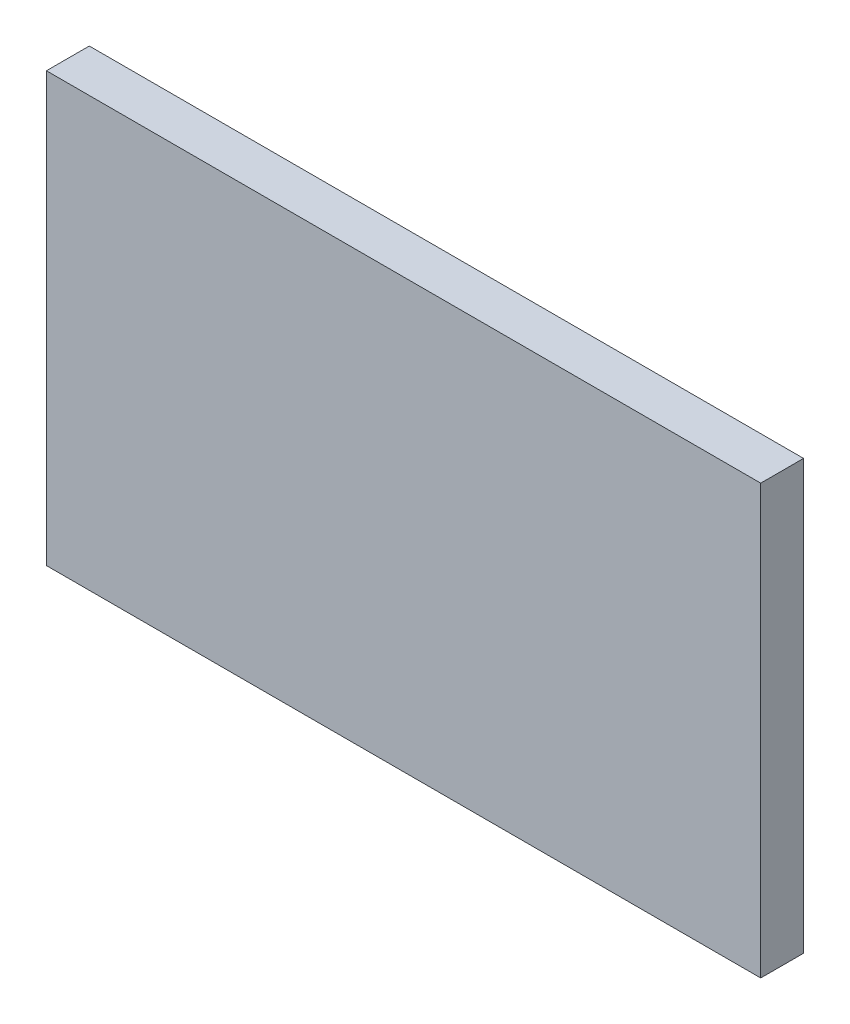
ISO-10303-21;
HEADER;
FILE_DESCRIPTION(('STEP AP214'),'2;1');
FILE_NAME('part.step','',(''),(''),'','','');
FILE_SCHEMA(('AUTOMOTIVE_DESIGN { 1 0 10303 214 1 1 1 1 }'));
ENDSEC;
DATA;
#1=APPLICATION_CONTEXT('core data for automotive mechanical design processes');
#2=APPLICATION_PROTOCOL_DEFINITION('international standard','automotive_design',2000,#1);
#3=PRODUCT_CONTEXT('',#1,'mechanical');
#4=PRODUCT('Part','Part','',(#3));
#5=PRODUCT_RELATED_PRODUCT_CATEGORY('part','',(#4));
#6=PRODUCT_DEFINITION_FORMATION('','',#4);
#7=PRODUCT_DEFINITION_CONTEXT('part definition',#1,'design');
#8=PRODUCT_DEFINITION('design','',#6,#7);
#9=PRODUCT_DEFINITION_SHAPE('','',#8);
#10=(LENGTH_UNIT() NAMED_UNIT(*) SI_UNIT(.MILLI.,.METRE.));
#11=(NAMED_UNIT(*) PLANE_ANGLE_UNIT() SI_UNIT($,.RADIAN.));
#12=(NAMED_UNIT(*) SI_UNIT($,.STERADIAN.) SOLID_ANGLE_UNIT());
#13=UNCERTAINTY_MEASURE_WITH_UNIT(LENGTH_MEASURE(1.E-05),#10,'distance_accuracy_value','');
#14=(GEOMETRIC_REPRESENTATION_CONTEXT(3) GLOBAL_UNCERTAINTY_ASSIGNED_CONTEXT((#13)) GLOBAL_UNIT_ASSIGNED_CONTEXT((#10,
#11,#12)) REPRESENTATION_CONTEXT('',''));
#15=CARTESIAN_POINT('',(0.,0.,0.));
#16=DIRECTION('',(0.,0.,1.));
#17=DIRECTION('',(1.,0.,0.));
#18=AXIS2_PLACEMENT_3D('',#15,#16,#17);
#19=CARTESIAN_POINT('',(6.200003917637,4.299994762363,0.2999994));
#20=DIRECTION('',(0.,0.,-1.));
#21=DIRECTION('',(-1.,0.,0.));
#22=AXIS2_PLACEMENT_3D('',#19,#20,#21);
#23=PLANE('',#22);
#24=DIRECTION('',(0.,1.,0.));
#25=VECTOR('',#24,1.);
#26=CARTESIAN_POINT('',(3.700003837637,2.799995222363,0.2999994));
#27=LINE('',#26,#25);
#28=CARTESIAN_POINT('',(3.700003837637,2.799995222363,0.2999994));
#29=VERTEX_POINT('',#28);
#30=CARTESIAN_POINT('',(3.700003837637,5.799994302363,0.2999994));
#31=VERTEX_POINT('',#30);
#32=EDGE_CURVE('E68',#29,#31,#27,.T.);
#33=ORIENTED_EDGE('',*,*,#32,.F.);
#34=DIRECTION('',(1.,0.,0.));
#35=VECTOR('',#34,1.);
#36=CARTESIAN_POINT('',(8.700003997637,2.799995222363,0.2999994));
#37=LINE('',#36,#35);
#38=CARTESIAN_POINT('',(8.700003997637,2.799995222363,0.2999994));
#39=VERTEX_POINT('',#38);
#40=EDGE_CURVE('E55',#39,#29,#37,.F.);
#41=ORIENTED_EDGE('',*,*,#40,.F.);
#42=DIRECTION('',(0.,1.,0.));
#43=VECTOR('',#42,1.);
#44=CARTESIAN_POINT('',(8.700003997637,5.799994302363,0.2999994));
#45=LINE('',#44,#43);
#46=CARTESIAN_POINT('',(8.700003997637,5.799994302363,0.2999994));
#47=VERTEX_POINT('',#46);
#48=EDGE_CURVE('E20',#47,#39,#45,.F.);
#49=ORIENTED_EDGE('',*,*,#48,.F.);
#50=DIRECTION('',(1.,0.,0.));
#51=VECTOR('',#50,1.);
#52=CARTESIAN_POINT('',(3.700003837637,5.799994302363,0.2999994));
#53=LINE('',#52,#51);
#54=EDGE_CURVE('E80',#31,#47,#53,.T.);
#55=ORIENTED_EDGE('',*,*,#54,.F.);
#56=EDGE_LOOP('',(#33,#41,#49,#55));
#57=FACE_BOUND('',#56,.T.);
#58=ADVANCED_FACE('F17',(#57),#23,.F.);
#59=CARTESIAN_POINT('',(8.700003997637,5.799994302363,0.));
#60=DIRECTION('',(1.,0.,0.));
#61=DIRECTION('',(0.,0.,-1.));
#62=AXIS2_PLACEMENT_3D('',#59,#60,#61);
#63=PLANE('',#62);
#64=DIRECTION('',(0.,0.,-1.));
#65=VECTOR('',#64,1.);
#66=CARTESIAN_POINT('',(8.700003997637,2.799995222363,0.));
#67=LINE('',#66,#65);
#68=CARTESIAN_POINT('',(8.700003997637,2.799995222363,0.));
#69=VERTEX_POINT('',#68);
#70=EDGE_CURVE('E61',#69,#39,#67,.F.);
#71=ORIENTED_EDGE('',*,*,#70,.F.);
#72=DIRECTION('',(0.,1.,0.));
#73=VECTOR('',#72,1.);
#74=CARTESIAN_POINT('',(8.700003997637,4.299994762363,0.));
#75=LINE('',#74,#73);
#76=CARTESIAN_POINT('',(8.700003997637,5.799994302363,0.));
#77=VERTEX_POINT('',#76);
#78=EDGE_CURVE('E83',#77,#69,#75,.F.);
#79=ORIENTED_EDGE('',*,*,#78,.F.);
#80=DIRECTION('',(0.,0.,1.));
#81=VECTOR('',#80,1.);
#82=CARTESIAN_POINT('',(8.700003997637,5.799994302363,0.));
#83=LINE('',#82,#81);
#84=EDGE_CURVE('E64',#47,#77,#83,.F.);
#85=ORIENTED_EDGE('',*,*,#84,.F.);
#86=ORIENTED_EDGE('',*,*,#48,.T.);
#87=EDGE_LOOP('',(#71,#79,#85,#86));
#88=FACE_BOUND('',#87,.T.);
#89=ADVANCED_FACE('F60',(#88),#63,.T.);
#90=CARTESIAN_POINT('',(8.700003997637,2.799995222363,0.));
#91=DIRECTION('',(0.,-1.,0.));
#92=DIRECTION('',(0.,0.,-1.));
#93=AXIS2_PLACEMENT_3D('',#90,#91,#92);
#94=PLANE('',#93);
#95=DIRECTION('',(0.,0.,1.));
#96=VECTOR('',#95,1.);
#97=CARTESIAN_POINT('',(3.700003837637,2.799995222363,0.));
#98=LINE('',#97,#96);
#99=CARTESIAN_POINT('',(3.700003837637,2.799995222363,0.));
#100=VERTEX_POINT('',#99);
#101=EDGE_CURVE('E70',#100,#29,#98,.T.);
#102=ORIENTED_EDGE('',*,*,#101,.F.);
#103=DIRECTION('',(-1.,0.,0.));
#104=VECTOR('',#103,1.);
#105=CARTESIAN_POINT('',(6.200003917637,2.799995222363,0.));
#106=LINE('',#105,#104);
#107=EDGE_CURVE('E74',#69,#100,#106,.T.);
#108=ORIENTED_EDGE('',*,*,#107,.F.);
#109=ORIENTED_EDGE('',*,*,#70,.T.);
#110=ORIENTED_EDGE('',*,*,#40,.T.);
#111=EDGE_LOOP('',(#102,#108,#109,#110));
#112=FACE_BOUND('',#111,.T.);
#113=ADVANCED_FACE('F72',(#112),#94,.T.);
#114=CARTESIAN_POINT('',(3.700003837637,2.799995222363,0.));
#115=DIRECTION('',(-1.,0.,0.));
#116=DIRECTION('',(0.,0.,1.));
#117=AXIS2_PLACEMENT_3D('',#114,#115,#116);
#118=PLANE('',#117);
#119=DIRECTION('',(0.,0.,1.));
#120=VECTOR('',#119,1.);
#121=CARTESIAN_POINT('',(3.700003837637,5.799994302363,0.));
#122=LINE('',#121,#120);
#123=CARTESIAN_POINT('',(3.700003837637,5.799994302363,0.));
#124=VERTEX_POINT('',#123);
#125=EDGE_CURVE('E35',#124,#31,#122,.T.);
#126=ORIENTED_EDGE('',*,*,#125,.F.);
#127=DIRECTION('',(0.,1.,0.));
#128=VECTOR('',#127,1.);
#129=CARTESIAN_POINT('',(3.700003837637,4.299994762363,0.));
#130=LINE('',#129,#128);
#131=EDGE_CURVE('E26',#100,#124,#130,.T.);
#132=ORIENTED_EDGE('',*,*,#131,.F.);
#133=ORIENTED_EDGE('',*,*,#101,.T.);
#134=ORIENTED_EDGE('',*,*,#32,.T.);
#135=EDGE_LOOP('',(#126,#132,#133,#134));
#136=FACE_BOUND('',#135,.T.);
#137=ADVANCED_FACE('F89',(#136),#118,.T.);
#138=CARTESIAN_POINT('',(3.700003837637,5.799994302363,0.));
#139=DIRECTION('',(0.,1.,0.));
#140=DIRECTION('',(0.,0.,1.));
#141=AXIS2_PLACEMENT_3D('',#138,#139,#140);
#142=PLANE('',#141);
#143=ORIENTED_EDGE('',*,*,#84,.T.);
#144=DIRECTION('',(-1.,0.,0.));
#145=VECTOR('',#144,1.);
#146=CARTESIAN_POINT('',(6.200003917637,5.799994302363,0.));
#147=LINE('',#146,#145);
#148=EDGE_CURVE('E11',#124,#77,#147,.F.);
#149=ORIENTED_EDGE('',*,*,#148,.F.);
#150=ORIENTED_EDGE('',*,*,#125,.T.);
#151=ORIENTED_EDGE('',*,*,#54,.T.);
#152=EDGE_LOOP('',(#143,#149,#150,#151));
#153=FACE_BOUND('',#152,.T.);
#154=ADVANCED_FACE('F91',(#153),#142,.T.);
#155=CARTESIAN_POINT('',(6.200003917637,4.299994762363,0.));
#156=DIRECTION('',(0.,0.,-1.));
#157=DIRECTION('',(-1.,0.,0.));
#158=AXIS2_PLACEMENT_3D('',#155,#156,#157);
#159=PLANE('',#158);
#160=ORIENTED_EDGE('',*,*,#131,.T.);
#161=ORIENTED_EDGE('',*,*,#148,.T.);
#162=ORIENTED_EDGE('',*,*,#78,.T.);
#163=ORIENTED_EDGE('',*,*,#107,.T.);
#164=EDGE_LOOP('',(#160,#161,#162,#163));
#165=FACE_BOUND('',#164,.T.);
#166=ADVANCED_FACE('F88',(#165),#159,.T.);
#167=CLOSED_SHELL('',(#58,#89,#113,#137,#154,#166));
#168=MANIFOLD_SOLID_BREP('B1',#167);
#169=ADVANCED_BREP_SHAPE_REPRESENTATION('',(#18,#168),#14);
#170=SHAPE_DEFINITION_REPRESENTATION(#9,#169);
ENDSEC;
END-ISO-10303-21;
